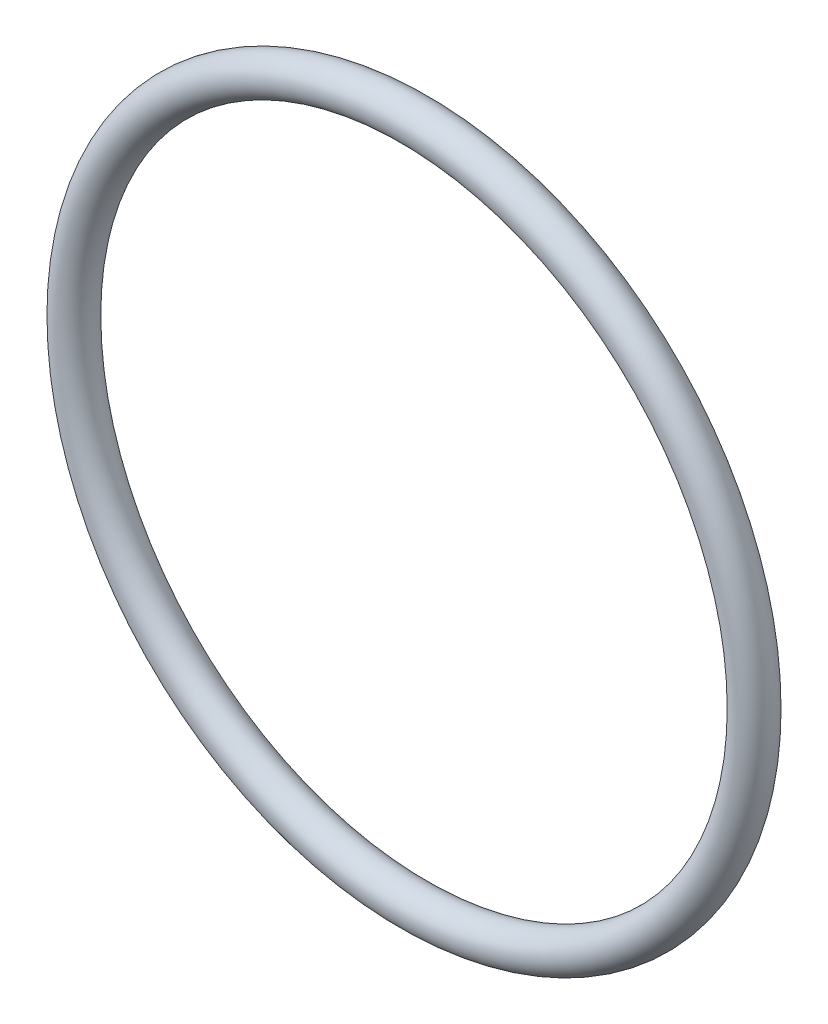
ISO-10303-21;
HEADER;
FILE_DESCRIPTION(('STEP AP214'),'2;1');
FILE_NAME('part.step','',(''),(''),'','','');
FILE_SCHEMA(('AUTOMOTIVE_DESIGN { 1 0 10303 214 1 1 1 1 }'));
ENDSEC;
DATA;
#1=APPLICATION_CONTEXT('core data for automotive mechanical design processes');
#2=APPLICATION_PROTOCOL_DEFINITION('international standard','automotive_design',2000,#1);
#3=PRODUCT_CONTEXT('',#1,'mechanical');
#4=PRODUCT('Part','Part','',(#3));
#5=PRODUCT_RELATED_PRODUCT_CATEGORY('part','',(#4));
#6=PRODUCT_DEFINITION_FORMATION('','',#4);
#7=PRODUCT_DEFINITION_CONTEXT('part definition',#1,'design');
#8=PRODUCT_DEFINITION('design','',#6,#7);
#9=PRODUCT_DEFINITION_SHAPE('','',#8);
#10=(LENGTH_UNIT() NAMED_UNIT(*) SI_UNIT(.MILLI.,.METRE.));
#11=(NAMED_UNIT(*) PLANE_ANGLE_UNIT() SI_UNIT($,.RADIAN.));
#12=(NAMED_UNIT(*) SI_UNIT($,.STERADIAN.) SOLID_ANGLE_UNIT());
#13=UNCERTAINTY_MEASURE_WITH_UNIT(LENGTH_MEASURE(1.E-05),#10,'distance_accuracy_value','');
#14=(GEOMETRIC_REPRESENTATION_CONTEXT(3) GLOBAL_UNCERTAINTY_ASSIGNED_CONTEXT((#13)) GLOBAL_UNIT_ASSIGNED_CONTEXT((#10,
#11,#12)) REPRESENTATION_CONTEXT('',''));
#15=CARTESIAN_POINT('',(0.,0.,0.));
#16=DIRECTION('',(0.,0.,1.));
#17=DIRECTION('',(1.,0.,0.));
#18=AXIS2_PLACEMENT_3D('',#15,#16,#17);
#19=CARTESIAN_POINT('',(0.,0.,0.));
#20=DIRECTION('',(0.,0.,1.));
#21=DIRECTION('',(1.,0.,0.));
#22=AXIS2_PLACEMENT_3D('',#19,#20,#21);
#23=TOROIDAL_SURFACE('',#22,15.875,0.889);
#24=CARTESIAN_POINT('',(16.764,0.,0.));
#25=VERTEX_POINT('',#24);
#26=VERTEX_LOOP('',#25);
#27=FACE_BOUND('',#26,.T.);
#28=ADVANCED_FACE('F39',(#27),#23,.T.);
#29=CLOSED_SHELL('',(#28));
#30=MANIFOLD_SOLID_BREP('B2',#29);
#31=ADVANCED_BREP_SHAPE_REPRESENTATION('',(#18,#30),#14);
#32=SHAPE_DEFINITION_REPRESENTATION(#9,#31);
ENDSEC;
END-ISO-10303-21;
